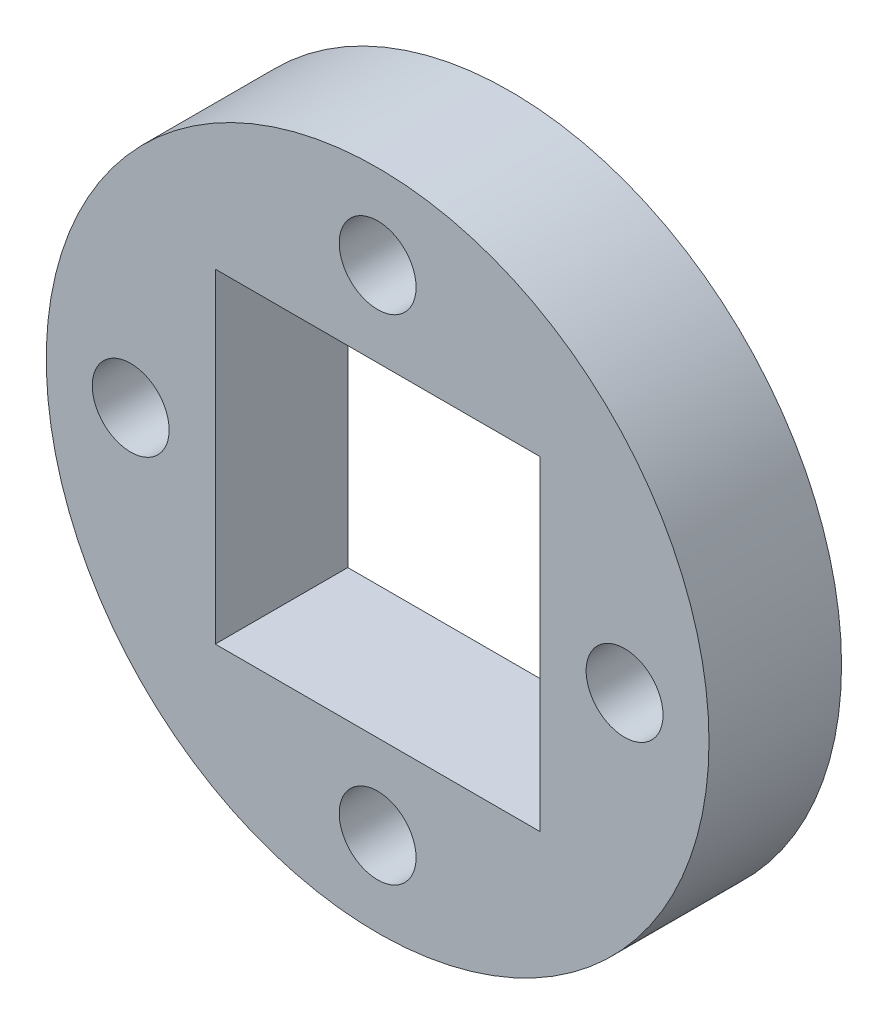
ISO-10303-21;
HEADER;
FILE_DESCRIPTION(('STEP AP214'),'2;1');
FILE_NAME('part.step','',(''),(''),'','','');
FILE_SCHEMA(('AUTOMOTIVE_DESIGN { 1 0 10303 214 1 1 1 1 }'));
ENDSEC;
DATA;
#1=APPLICATION_CONTEXT('core data for automotive mechanical design processes');
#2=APPLICATION_PROTOCOL_DEFINITION('international standard','automotive_design',2000,#1);
#3=PRODUCT_CONTEXT('',#1,'mechanical');
#4=PRODUCT('Part','Part','',(#3));
#5=PRODUCT_RELATED_PRODUCT_CATEGORY('part','',(#4));
#6=PRODUCT_DEFINITION_FORMATION('','',#4);
#7=PRODUCT_DEFINITION_CONTEXT('part definition',#1,'design');
#8=PRODUCT_DEFINITION('design','',#6,#7);
#9=PRODUCT_DEFINITION_SHAPE('','',#8);
#10=(LENGTH_UNIT() NAMED_UNIT(*) SI_UNIT(.MILLI.,.METRE.));
#11=(NAMED_UNIT(*) PLANE_ANGLE_UNIT() SI_UNIT($,.RADIAN.));
#12=(NAMED_UNIT(*) SI_UNIT($,.STERADIAN.) SOLID_ANGLE_UNIT());
#13=UNCERTAINTY_MEASURE_WITH_UNIT(LENGTH_MEASURE(1.E-05),#10,'distance_accuracy_value','');
#14=(GEOMETRIC_REPRESENTATION_CONTEXT(3) GLOBAL_UNCERTAINTY_ASSIGNED_CONTEXT((#13)) GLOBAL_UNIT_ASSIGNED_CONTEXT((#10,
#11,#12)) REPRESENTATION_CONTEXT('',''));
#15=CARTESIAN_POINT('',(0.,0.,0.));
#16=DIRECTION('',(0.,0.,1.));
#17=DIRECTION('',(1.,0.,0.));
#18=AXIS2_PLACEMENT_3D('',#15,#16,#17);
#19=CARTESIAN_POINT('',(0.,0.,2.5));
#20=DIRECTION('',(0.,0.,-1.));
#21=DIRECTION('',(-1.,0.,0.));
#22=AXIS2_PLACEMENT_3D('',#19,#20,#21);
#23=CYLINDRICAL_SURFACE('',#22,12.5);
#24=CARTESIAN_POINT('',(0.,0.,2.5));
#25=DIRECTION('',(0.,0.,1.));
#26=DIRECTION('',(1.,0.,0.));
#27=AXIS2_PLACEMENT_3D('',#24,#25,#26);
#28=CIRCLE('',#27,12.5);
#29=CARTESIAN_POINT('',(12.5,0.,2.5));
#30=VERTEX_POINT('',#29);
#31=EDGE_CURVE('E11',#30,#30,#28,.T.);
#32=ORIENTED_EDGE('',*,*,#31,.F.);
#33=EDGE_LOOP('',(#32));
#34=FACE_BOUND('',#33,.T.);
#35=CARTESIAN_POINT('',(0.,0.,-2.5));
#36=DIRECTION('',(0.,0.,1.));
#37=DIRECTION('',(1.,0.,0.));
#38=AXIS2_PLACEMENT_3D('',#35,#36,#37);
#39=CIRCLE('',#38,12.5);
#40=CARTESIAN_POINT('',(12.5,0.,-2.5));
#41=VERTEX_POINT('',#40);
#42=EDGE_CURVE('E39',#41,#41,#39,.T.);
#43=ORIENTED_EDGE('',*,*,#42,.T.);
#44=EDGE_LOOP('',(#43));
#45=FACE_BOUND('',#44,.T.);
#46=ADVANCED_FACE('F36',(#34,#45),#23,.T.);
#47=CARTESIAN_POINT('',(0.,0.,2.5));
#48=DIRECTION('',(0.,0.,1.));
#49=DIRECTION('',(1.,0.,0.));
#50=AXIS2_PLACEMENT_3D('',#47,#48,#49);
#51=PLANE('',#50);
#52=CARTESIAN_POINT('',(9.315,0.,2.5));
#53=DIRECTION('',(0.,0.,1.));
#54=DIRECTION('',(1.,0.,0.));
#55=AXIS2_PLACEMENT_3D('',#52,#53,#54);
#56=CIRCLE('',#55,1.45);
#57=CARTESIAN_POINT('',(10.765,0.,2.5));
#58=VERTEX_POINT('',#57);
#59=EDGE_CURVE('E121',#58,#58,#56,.T.);
#60=ORIENTED_EDGE('',*,*,#59,.F.);
#61=EDGE_LOOP('',(#60));
#62=FACE_BOUND('',#61,.T.);
#63=CARTESIAN_POINT('',(0.,-9.315,2.5));
#64=DIRECTION('',(0.,0.,1.));
#65=DIRECTION('',(1.,0.,0.));
#66=AXIS2_PLACEMENT_3D('',#63,#64,#65);
#67=CIRCLE('',#66,1.45);
#68=CARTESIAN_POINT('',(1.44999999999997,-9.315,2.5));
#69=VERTEX_POINT('',#68);
#70=EDGE_CURVE('E134',#69,#69,#67,.T.);
#71=ORIENTED_EDGE('',*,*,#70,.F.);
#72=EDGE_LOOP('',(#71));
#73=FACE_BOUND('',#72,.T.);
#74=CARTESIAN_POINT('',(-9.315,0.,2.5));
#75=DIRECTION('',(0.,0.,1.));
#76=DIRECTION('',(1.,0.,0.));
#77=AXIS2_PLACEMENT_3D('',#74,#75,#76);
#78=CIRCLE('',#77,1.45);
#79=CARTESIAN_POINT('',(-7.865,0.,2.5));
#80=VERTEX_POINT('',#79);
#81=EDGE_CURVE('E127',#80,#80,#78,.T.);
#82=ORIENTED_EDGE('',*,*,#81,.F.);
#83=EDGE_LOOP('',(#82));
#84=FACE_BOUND('',#83,.T.);
#85=CARTESIAN_POINT('',(0.,9.315,2.5));
#86=DIRECTION('',(0.,0.,1.));
#87=DIRECTION('',(1.,0.,0.));
#88=AXIS2_PLACEMENT_3D('',#85,#86,#87);
#89=CIRCLE('',#88,1.45);
#90=CARTESIAN_POINT('',(1.4500000000001,9.315,2.5));
#91=VERTEX_POINT('',#90);
#92=EDGE_CURVE('E128',#91,#91,#89,.T.);
#93=ORIENTED_EDGE('',*,*,#92,.F.);
#94=EDGE_LOOP('',(#93));
#95=FACE_BOUND('',#94,.T.);
#96=DIRECTION('',(0.,1.,0.));
#97=VECTOR('',#96,1.);
#98=CARTESIAN_POINT('',(6.125,6.125,2.5));
#99=LINE('',#98,#97);
#100=CARTESIAN_POINT('',(6.125,-6.125,2.5));
#101=VERTEX_POINT('',#100);
#102=CARTESIAN_POINT('',(6.125,6.125,2.5));
#103=VERTEX_POINT('',#102);
#104=EDGE_CURVE('E50',#101,#103,#99,.T.);
#105=ORIENTED_EDGE('',*,*,#104,.F.);
#106=DIRECTION('',(1.,0.,0.));
#107=VECTOR('',#106,1.);
#108=CARTESIAN_POINT('',(-6.125,-6.125,2.5));
#109=LINE('',#108,#107);
#110=CARTESIAN_POINT('',(-6.125,-6.125,2.5));
#111=VERTEX_POINT('',#110);
#112=EDGE_CURVE('E84',#111,#101,#109,.T.);
#113=ORIENTED_EDGE('',*,*,#112,.F.);
#114=DIRECTION('',(0.,-1.,0.));
#115=VECTOR('',#114,1.);
#116=CARTESIAN_POINT('',(-6.125,6.125,2.5));
#117=LINE('',#116,#115);
#118=CARTESIAN_POINT('',(-6.125,6.125,2.5));
#119=VERTEX_POINT('',#118);
#120=EDGE_CURVE('E103',#119,#111,#117,.T.);
#121=ORIENTED_EDGE('',*,*,#120,.F.);
#122=DIRECTION('',(-1.,0.,0.));
#123=VECTOR('',#122,1.);
#124=CARTESIAN_POINT('',(-6.125,6.125,2.5));
#125=LINE('',#124,#123);
#126=EDGE_CURVE('E97',#103,#119,#125,.T.);
#127=ORIENTED_EDGE('',*,*,#126,.F.);
#128=EDGE_LOOP('',(#105,#113,#121,#127));
#129=FACE_BOUND('',#128,.T.);
#130=ORIENTED_EDGE('',*,*,#31,.T.);
#131=EDGE_LOOP('',(#130));
#132=FACE_BOUND('',#131,.T.);
#133=ADVANCED_FACE('F115',(#62,#73,#84,#95,#129,#132),#51,.T.);
#134=CARTESIAN_POINT('',(0.,0.,-2.5));
#135=DIRECTION('',(0.,0.,1.));
#136=DIRECTION('',(1.,0.,0.));
#137=AXIS2_PLACEMENT_3D('',#134,#135,#136);
#138=PLANE('',#137);
#139=CARTESIAN_POINT('',(9.315,0.,-2.5));
#140=DIRECTION('',(0.,0.,1.));
#141=DIRECTION('',(1.,0.,0.));
#142=AXIS2_PLACEMENT_3D('',#139,#140,#141);
#143=CIRCLE('',#142,1.45);
#144=CARTESIAN_POINT('',(10.765,0.,-2.5));
#145=VERTEX_POINT('',#144);
#146=EDGE_CURVE('E119',#145,#145,#143,.F.);
#147=ORIENTED_EDGE('',*,*,#146,.F.);
#148=EDGE_LOOP('',(#147));
#149=FACE_BOUND('',#148,.T.);
#150=CARTESIAN_POINT('',(0.,-9.315,-2.5));
#151=DIRECTION('',(0.,0.,1.));
#152=DIRECTION('',(1.,0.,0.));
#153=AXIS2_PLACEMENT_3D('',#150,#151,#152);
#154=CIRCLE('',#153,1.45);
#155=CARTESIAN_POINT('',(1.44999999999997,-9.315,-2.5));
#156=VERTEX_POINT('',#155);
#157=EDGE_CURVE('E137',#156,#156,#154,.F.);
#158=ORIENTED_EDGE('',*,*,#157,.F.);
#159=EDGE_LOOP('',(#158));
#160=FACE_BOUND('',#159,.T.);
#161=CARTESIAN_POINT('',(-9.315,0.,-2.5));
#162=DIRECTION('',(0.,0.,1.));
#163=DIRECTION('',(1.,0.,0.));
#164=AXIS2_PLACEMENT_3D('',#161,#162,#163);
#165=CIRCLE('',#164,1.45);
#166=CARTESIAN_POINT('',(-7.865,0.,-2.5));
#167=VERTEX_POINT('',#166);
#168=EDGE_CURVE('E131',#167,#167,#165,.F.);
#169=ORIENTED_EDGE('',*,*,#168,.F.);
#170=EDGE_LOOP('',(#169));
#171=FACE_BOUND('',#170,.T.);
#172=CARTESIAN_POINT('',(0.,9.315,-2.5));
#173=DIRECTION('',(0.,0.,1.));
#174=DIRECTION('',(1.,0.,0.));
#175=AXIS2_PLACEMENT_3D('',#172,#173,#174);
#176=CIRCLE('',#175,1.45);
#177=CARTESIAN_POINT('',(1.4500000000001,9.315,-2.5));
#178=VERTEX_POINT('',#177);
#179=EDGE_CURVE('E124',#178,#178,#176,.F.);
#180=ORIENTED_EDGE('',*,*,#179,.F.);
#181=EDGE_LOOP('',(#180));
#182=FACE_BOUND('',#181,.T.);
#183=DIRECTION('',(-1.,0.,0.));
#184=VECTOR('',#183,1.);
#185=CARTESIAN_POINT('',(-6.125,-6.125,-2.5));
#186=LINE('',#185,#184);
#187=CARTESIAN_POINT('',(6.125,-6.125,-2.5));
#188=VERTEX_POINT('',#187);
#189=CARTESIAN_POINT('',(-6.125,-6.125,-2.5));
#190=VERTEX_POINT('',#189);
#191=EDGE_CURVE('E95',#188,#190,#186,.T.);
#192=ORIENTED_EDGE('',*,*,#191,.F.);
#193=DIRECTION('',(0.,-1.,0.));
#194=VECTOR('',#193,1.);
#195=CARTESIAN_POINT('',(6.125,6.125,-2.5));
#196=LINE('',#195,#194);
#197=CARTESIAN_POINT('',(6.125,6.125,-2.5));
#198=VERTEX_POINT('',#197);
#199=EDGE_CURVE('E78',#198,#188,#196,.T.);
#200=ORIENTED_EDGE('',*,*,#199,.F.);
#201=DIRECTION('',(1.,0.,0.));
#202=VECTOR('',#201,1.);
#203=CARTESIAN_POINT('',(-6.125,6.125,-2.5));
#204=LINE('',#203,#202);
#205=CARTESIAN_POINT('',(-6.125,6.125,-2.5));
#206=VERTEX_POINT('',#205);
#207=EDGE_CURVE('E87',#206,#198,#204,.T.);
#208=ORIENTED_EDGE('',*,*,#207,.F.);
#209=DIRECTION('',(0.,1.,0.));
#210=VECTOR('',#209,1.);
#211=CARTESIAN_POINT('',(-6.125,6.125,-2.5));
#212=LINE('',#211,#210);
#213=EDGE_CURVE('E58',#190,#206,#212,.T.);
#214=ORIENTED_EDGE('',*,*,#213,.F.);
#215=EDGE_LOOP('',(#192,#200,#208,#214));
#216=FACE_BOUND('',#215,.T.);
#217=ORIENTED_EDGE('',*,*,#42,.F.);
#218=EDGE_LOOP('',(#217));
#219=FACE_BOUND('',#218,.T.);
#220=ADVANCED_FACE('F92',(#149,#160,#171,#182,#216,#219),#138,.F.);
#221=CARTESIAN_POINT('',(6.125,6.125,-2.501));
#222=DIRECTION('',(1.,0.,0.));
#223=DIRECTION('',(0.,1.,0.));
#224=AXIS2_PLACEMENT_3D('',#221,#222,#223);
#225=PLANE('',#224);
#226=ORIENTED_EDGE('',*,*,#199,.T.);
#227=DIRECTION('',(0.,0.,1.));
#228=VECTOR('',#227,1.);
#229=CARTESIAN_POINT('',(6.125,-6.125,-2.501));
#230=LINE('',#229,#228);
#231=EDGE_CURVE('E90',#188,#101,#230,.T.);
#232=ORIENTED_EDGE('',*,*,#231,.T.);
#233=ORIENTED_EDGE('',*,*,#104,.T.);
#234=DIRECTION('',(0.,0.,1.));
#235=VECTOR('',#234,1.);
#236=CARTESIAN_POINT('',(6.125,6.125,-2.501));
#237=LINE('',#236,#235);
#238=EDGE_CURVE('E74',#198,#103,#237,.T.);
#239=ORIENTED_EDGE('',*,*,#238,.F.);
#240=EDGE_LOOP('',(#226,#232,#233,#239));
#241=FACE_BOUND('',#240,.T.);
#242=ADVANCED_FACE('F76',(#241),#225,.F.);
#243=CARTESIAN_POINT('',(-6.125,-6.125,-2.501));
#244=DIRECTION('',(0.,-1.,0.));
#245=DIRECTION('',(0.,0.,-1.));
#246=AXIS2_PLACEMENT_3D('',#243,#244,#245);
#247=PLANE('',#246);
#248=ORIENTED_EDGE('',*,*,#191,.T.);
#249=DIRECTION('',(0.,0.,1.));
#250=VECTOR('',#249,1.);
#251=CARTESIAN_POINT('',(-6.125,-6.125,-2.501));
#252=LINE('',#251,#250);
#253=EDGE_CURVE('E109',#190,#111,#252,.T.);
#254=ORIENTED_EDGE('',*,*,#253,.T.);
#255=ORIENTED_EDGE('',*,*,#112,.T.);
#256=ORIENTED_EDGE('',*,*,#231,.F.);
#257=EDGE_LOOP('',(#248,#254,#255,#256));
#258=FACE_BOUND('',#257,.T.);
#259=ADVANCED_FACE('F118',(#258),#247,.F.);
#260=CARTESIAN_POINT('',(-6.125,6.125,-2.501));
#261=DIRECTION('',(-1.,0.,0.));
#262=DIRECTION('',(0.,-1.,0.));
#263=AXIS2_PLACEMENT_3D('',#260,#261,#262);
#264=PLANE('',#263);
#265=ORIENTED_EDGE('',*,*,#213,.T.);
#266=DIRECTION('',(0.,0.,1.));
#267=VECTOR('',#266,1.);
#268=CARTESIAN_POINT('',(-6.125,6.125,-2.501));
#269=LINE('',#268,#267);
#270=EDGE_CURVE('E83',#206,#119,#269,.T.);
#271=ORIENTED_EDGE('',*,*,#270,.T.);
#272=ORIENTED_EDGE('',*,*,#120,.T.);
#273=ORIENTED_EDGE('',*,*,#253,.F.);
#274=EDGE_LOOP('',(#265,#271,#272,#273));
#275=FACE_BOUND('',#274,.T.);
#276=ADVANCED_FACE('F111',(#275),#264,.F.);
#277=CARTESIAN_POINT('',(-6.125,6.125,-2.501));
#278=DIRECTION('',(0.,1.,0.));
#279=DIRECTION('',(0.,0.,1.));
#280=AXIS2_PLACEMENT_3D('',#277,#278,#279);
#281=PLANE('',#280);
#282=ORIENTED_EDGE('',*,*,#207,.T.);
#283=ORIENTED_EDGE('',*,*,#238,.T.);
#284=ORIENTED_EDGE('',*,*,#126,.T.);
#285=ORIENTED_EDGE('',*,*,#270,.F.);
#286=EDGE_LOOP('',(#282,#283,#284,#285));
#287=FACE_BOUND('',#286,.T.);
#288=ADVANCED_FACE('F88',(#287),#281,.F.);
#289=CARTESIAN_POINT('',(0.,9.315,-2.501));
#290=DIRECTION('',(0.,0.,1.));
#291=DIRECTION('',(1.,0.,0.));
#292=AXIS2_PLACEMENT_3D('',#289,#290,#291);
#293=CYLINDRICAL_SURFACE('',#292,1.45);
#294=ORIENTED_EDGE('',*,*,#92,.T.);
#295=EDGE_LOOP('',(#294));
#296=FACE_BOUND('',#295,.T.);
#297=ORIENTED_EDGE('',*,*,#179,.T.);
#298=EDGE_LOOP('',(#297));
#299=FACE_BOUND('',#298,.T.);
#300=ADVANCED_FACE('F157',(#296,#299),#293,.F.);
#301=CARTESIAN_POINT('',(-9.315,0.,-2.501));
#302=DIRECTION('',(0.,0.,1.));
#303=DIRECTION('',(1.,0.,0.));
#304=AXIS2_PLACEMENT_3D('',#301,#302,#303);
#305=CYLINDRICAL_SURFACE('',#304,1.45);
#306=ORIENTED_EDGE('',*,*,#81,.T.);
#307=EDGE_LOOP('',(#306));
#308=FACE_BOUND('',#307,.T.);
#309=ORIENTED_EDGE('',*,*,#168,.T.);
#310=EDGE_LOOP('',(#309));
#311=FACE_BOUND('',#310,.T.);
#312=ADVANCED_FACE('F160',(#308,#311),#305,.F.);
#313=CARTESIAN_POINT('',(0.,-9.315,-2.501));
#314=DIRECTION('',(0.,0.,1.));
#315=DIRECTION('',(1.,0.,0.));
#316=AXIS2_PLACEMENT_3D('',#313,#314,#315);
#317=CYLINDRICAL_SURFACE('',#316,1.45);
#318=ORIENTED_EDGE('',*,*,#70,.T.);
#319=EDGE_LOOP('',(#318));
#320=FACE_BOUND('',#319,.T.);
#321=ORIENTED_EDGE('',*,*,#157,.T.);
#322=EDGE_LOOP('',(#321));
#323=FACE_BOUND('',#322,.T.);
#324=ADVANCED_FACE('F210',(#320,#323),#317,.F.);
#325=CARTESIAN_POINT('',(9.315,0.,-2.501));
#326=DIRECTION('',(0.,0.,1.));
#327=DIRECTION('',(1.,0.,0.));
#328=AXIS2_PLACEMENT_3D('',#325,#326,#327);
#329=CYLINDRICAL_SURFACE('',#328,1.45);
#330=ORIENTED_EDGE('',*,*,#59,.T.);
#331=EDGE_LOOP('',(#330));
#332=FACE_BOUND('',#331,.T.);
#333=ORIENTED_EDGE('',*,*,#146,.T.);
#334=EDGE_LOOP('',(#333));
#335=FACE_BOUND('',#334,.T.);
#336=ADVANCED_FACE('F145',(#332,#335),#329,.F.);
#337=CLOSED_SHELL('',(#46,#133,#220,#242,#259,#276,#288,#300,#312,#324,#336));
#338=MANIFOLD_SOLID_BREP('B2',#337);
#339=ADVANCED_BREP_SHAPE_REPRESENTATION('',(#18,#338),#14);
#340=SHAPE_DEFINITION_REPRESENTATION(#9,#339);
ENDSEC;
END-ISO-10303-21;
